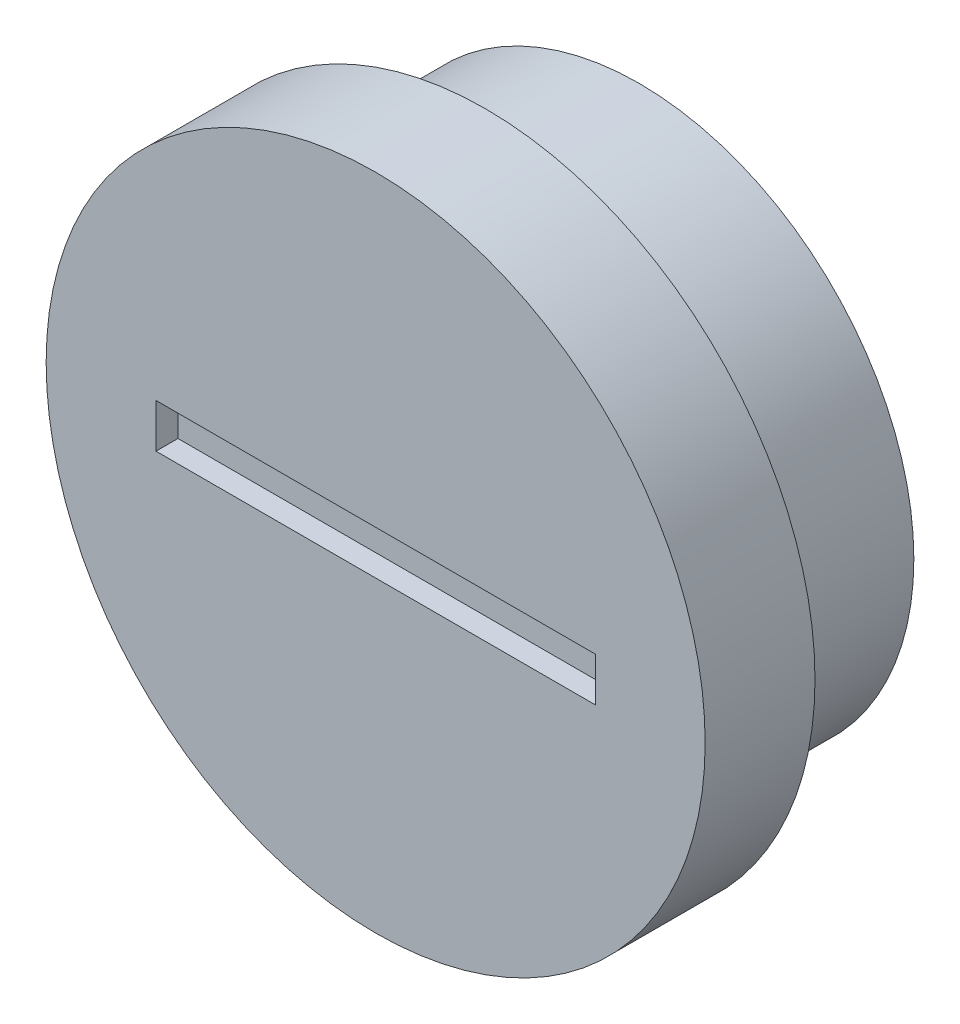
ISO-10303-21;
HEADER;
FILE_DESCRIPTION(('STEP AP214'),'2;1');
FILE_NAME('part.step','',(''),(''),'','','');
FILE_SCHEMA(('AUTOMOTIVE_DESIGN { 1 0 10303 214 1 1 1 1 }'));
ENDSEC;
DATA;
#1=APPLICATION_CONTEXT('core data for automotive mechanical design processes');
#2=APPLICATION_PROTOCOL_DEFINITION('international standard','automotive_design',2000,#1);
#3=PRODUCT_CONTEXT('',#1,'mechanical');
#4=PRODUCT('Part','Part','',(#3));
#5=PRODUCT_RELATED_PRODUCT_CATEGORY('part','',(#4));
#6=PRODUCT_DEFINITION_FORMATION('','',#4);
#7=PRODUCT_DEFINITION_CONTEXT('part definition',#1,'design');
#8=PRODUCT_DEFINITION('design','',#6,#7);
#9=PRODUCT_DEFINITION_SHAPE('','',#8);
#10=(LENGTH_UNIT() NAMED_UNIT(*) SI_UNIT(.MILLI.,.METRE.));
#11=(NAMED_UNIT(*) PLANE_ANGLE_UNIT() SI_UNIT($,.RADIAN.));
#12=(NAMED_UNIT(*) SI_UNIT($,.STERADIAN.) SOLID_ANGLE_UNIT());
#13=UNCERTAINTY_MEASURE_WITH_UNIT(LENGTH_MEASURE(1.E-05),#10,'distance_accuracy_value','');
#14=(GEOMETRIC_REPRESENTATION_CONTEXT(3) GLOBAL_UNCERTAINTY_ASSIGNED_CONTEXT((#13)) GLOBAL_UNIT_ASSIGNED_CONTEXT((#10,
#11,#12)) REPRESENTATION_CONTEXT('',''));
#15=CARTESIAN_POINT('',(0.,0.,0.));
#16=DIRECTION('',(0.,0.,1.));
#17=DIRECTION('',(1.,0.,0.));
#18=AXIS2_PLACEMENT_3D('',#15,#16,#17);
#19=CARTESIAN_POINT('',(0.,0.,0.));
#20=DIRECTION('',(0.,0.,1.));
#21=DIRECTION('',(1.,0.,0.));
#22=AXIS2_PLACEMENT_3D('',#19,#20,#21);
#23=PLANE('',#22);
#24=CARTESIAN_POINT('',(0.,0.,0.));
#25=DIRECTION('',(0.,0.,1.));
#26=DIRECTION('',(1.,0.,0.));
#27=AXIS2_PLACEMENT_3D('',#24,#25,#26);
#28=CIRCLE('',#27,12.5);
#29=CARTESIAN_POINT('',(12.5,0.,0.));
#30=VERTEX_POINT('',#29);
#31=EDGE_CURVE('E180',#30,#30,#28,.T.);
#32=ORIENTED_EDGE('',*,*,#31,.F.);
#33=EDGE_LOOP('',(#32));
#34=FACE_BOUND('',#33,.T.);
#35=CARTESIAN_POINT('',(0.,0.,0.));
#36=DIRECTION('',(0.,0.,1.));
#37=DIRECTION('',(1.,0.,0.));
#38=AXIS2_PLACEMENT_3D('',#35,#36,#37);
#39=CIRCLE('',#38,10.65);
#40=CARTESIAN_POINT('',(10.65,0.,0.));
#41=VERTEX_POINT('',#40);
#42=EDGE_CURVE('E177',#41,#41,#39,.T.);
#43=ORIENTED_EDGE('',*,*,#42,.T.);
#44=EDGE_LOOP('',(#43));
#45=FACE_BOUND('',#44,.T.);
#46=ADVANCED_FACE('F32',(#34,#45),#23,.F.);
#47=CARTESIAN_POINT('',(0.,0.,7.));
#48=DIRECTION('',(0.,0.,-1.));
#49=DIRECTION('',(-1.,0.,0.));
#50=AXIS2_PLACEMENT_3D('',#47,#48,#49);
#51=CYLINDRICAL_SURFACE('',#50,12.5);
#52=CARTESIAN_POINT('',(0.,0.,7.));
#53=DIRECTION('',(0.,0.,1.));
#54=DIRECTION('',(1.,0.,0.));
#55=AXIS2_PLACEMENT_3D('',#52,#53,#54);
#56=CIRCLE('',#55,12.5);
#57=CARTESIAN_POINT('',(12.5,0.,7.));
#58=VERTEX_POINT('',#57);
#59=EDGE_CURVE('E40',#58,#58,#56,.T.);
#60=ORIENTED_EDGE('',*,*,#59,.F.);
#61=EDGE_LOOP('',(#60));
#62=FACE_BOUND('',#61,.T.);
#63=ORIENTED_EDGE('',*,*,#31,.T.);
#64=EDGE_LOOP('',(#63));
#65=FACE_BOUND('',#64,.T.);
#66=ADVANCED_FACE('F34',(#62,#65),#51,.T.);
#67=CARTESIAN_POINT('',(0.,0.,7.));
#68=DIRECTION('',(0.,0.,-1.));
#69=DIRECTION('',(-1.,0.,0.));
#70=AXIS2_PLACEMENT_3D('',#67,#68,#69);
#71=CYLINDRICAL_SURFACE('',#70,10.65);
#72=CARTESIAN_POINT('',(0.,0.,7.));
#73=DIRECTION('',(0.,0.,1.));
#74=DIRECTION('',(1.,0.,0.));
#75=AXIS2_PLACEMENT_3D('',#72,#73,#74);
#76=CIRCLE('',#75,10.65);
#77=CARTESIAN_POINT('',(10.65,0.,7.));
#78=VERTEX_POINT('',#77);
#79=EDGE_CURVE('E172',#78,#78,#76,.T.);
#80=ORIENTED_EDGE('',*,*,#79,.T.);
#81=EDGE_LOOP('',(#80));
#82=FACE_BOUND('',#81,.T.);
#83=ORIENTED_EDGE('',*,*,#42,.F.);
#84=EDGE_LOOP('',(#83));
#85=FACE_BOUND('',#84,.T.);
#86=ADVANCED_FACE('F190',(#82,#85),#71,.F.);
#87=CARTESIAN_POINT('',(0.,0.,7.));
#88=DIRECTION('',(0.,0.,1.));
#89=DIRECTION('',(1.,0.,0.));
#90=AXIS2_PLACEMENT_3D('',#87,#88,#89);
#91=PLANE('',#90);
#92=CARTESIAN_POINT('',(0.,0.,7.));
#93=DIRECTION('',(0.,0.,1.));
#94=DIRECTION('',(1.,0.,0.));
#95=AXIS2_PLACEMENT_3D('',#92,#93,#94);
#96=CIRCLE('',#95,9.);
#97=CARTESIAN_POINT('',(9.,0.,7.));
#98=VERTEX_POINT('',#97);
#99=EDGE_CURVE('E11',#98,#98,#96,.F.);
#100=ORIENTED_EDGE('',*,*,#99,.F.);
#101=EDGE_LOOP('',(#100));
#102=FACE_BOUND('',#101,.T.);
#103=ORIENTED_EDGE('',*,*,#79,.F.);
#104=EDGE_LOOP('',(#103));
#105=FACE_BOUND('',#104,.T.);
#106=ADVANCED_FACE('F192',(#102,#105),#91,.F.);
#107=CARTESIAN_POINT('',(0.,0.,12.));
#108=DIRECTION('',(0.,0.,-1.));
#109=DIRECTION('',(-1.,0.,0.));
#110=AXIS2_PLACEMENT_3D('',#107,#108,#109);
#111=CYLINDRICAL_SURFACE('',#110,15.);
#112=CARTESIAN_POINT('',(0.,0.,12.));
#113=DIRECTION('',(0.,0.,1.));
#114=DIRECTION('',(1.,0.,0.));
#115=AXIS2_PLACEMENT_3D('',#112,#113,#114);
#116=CIRCLE('',#115,15.);
#117=CARTESIAN_POINT('',(15.,0.,12.));
#118=VERTEX_POINT('',#117);
#119=EDGE_CURVE('E169',#118,#118,#116,.T.);
#120=ORIENTED_EDGE('',*,*,#119,.F.);
#121=EDGE_LOOP('',(#120));
#122=FACE_BOUND('',#121,.T.);
#123=CARTESIAN_POINT('',(0.,0.,7.));
#124=DIRECTION('',(0.,0.,1.));
#125=DIRECTION('',(1.,0.,0.));
#126=AXIS2_PLACEMENT_3D('',#123,#124,#125);
#127=CIRCLE('',#126,15.);
#128=CARTESIAN_POINT('',(15.,0.,7.));
#129=VERTEX_POINT('',#128);
#130=EDGE_CURVE('E168',#129,#129,#127,.T.);
#131=ORIENTED_EDGE('',*,*,#130,.T.);
#132=EDGE_LOOP('',(#131));
#133=FACE_BOUND('',#132,.T.);
#134=ADVANCED_FACE('F199',(#122,#133),#111,.T.);
#135=CARTESIAN_POINT('',(0.,0.,12.));
#136=DIRECTION('',(0.,0.,1.));
#137=DIRECTION('',(1.,0.,0.));
#138=AXIS2_PLACEMENT_3D('',#135,#136,#137);
#139=PLANE('',#138);
#140=DIRECTION('',(0.,1.,0.));
#141=VECTOR('',#140,1.);
#142=CARTESIAN_POINT('',(10.,-1.,12.));
#143=LINE('',#142,#141);
#144=CARTESIAN_POINT('',(10.,-1.,12.));
#145=VERTEX_POINT('',#144);
#146=CARTESIAN_POINT('',(10.,1.,12.));
#147=VERTEX_POINT('',#146);
#148=EDGE_CURVE('E55',#145,#147,#143,.T.);
#149=ORIENTED_EDGE('',*,*,#148,.F.);
#150=DIRECTION('',(1.,0.,0.));
#151=VECTOR('',#150,1.);
#152=CARTESIAN_POINT('',(-10.,-1.,12.));
#153=LINE('',#152,#151);
#154=CARTESIAN_POINT('',(-10.,-1.,12.));
#155=VERTEX_POINT('',#154);
#156=EDGE_CURVE('E139',#155,#145,#153,.T.);
#157=ORIENTED_EDGE('',*,*,#156,.F.);
#158=DIRECTION('',(0.,-1.,0.));
#159=VECTOR('',#158,1.);
#160=CARTESIAN_POINT('',(-10.,-1.,12.));
#161=LINE('',#160,#159);
#162=CARTESIAN_POINT('',(-10.,1.,12.));
#163=VERTEX_POINT('',#162);
#164=EDGE_CURVE('E153',#163,#155,#161,.T.);
#165=ORIENTED_EDGE('',*,*,#164,.F.);
#166=DIRECTION('',(-1.,0.,0.));
#167=VECTOR('',#166,1.);
#168=CARTESIAN_POINT('',(-10.,1.,12.));
#169=LINE('',#168,#167);
#170=EDGE_CURVE('E150',#147,#163,#169,.T.);
#171=ORIENTED_EDGE('',*,*,#170,.F.);
#172=EDGE_LOOP('',(#149,#157,#165,#171));
#173=FACE_BOUND('',#172,.T.);
#174=ORIENTED_EDGE('',*,*,#119,.T.);
#175=EDGE_LOOP('',(#174));
#176=FACE_BOUND('',#175,.T.);
#177=ADVANCED_FACE('F206',(#173,#176),#139,.T.);
#178=ORIENTED_EDGE('',*,*,#59,.T.);
#179=EDGE_LOOP('',(#178));
#180=FACE_BOUND('',#179,.T.);
#181=ORIENTED_EDGE('',*,*,#130,.F.);
#182=EDGE_LOOP('',(#181));
#183=FACE_BOUND('',#182,.T.);
#184=ADVANCED_FACE('F202',(#180,#183),#91,.F.);
#185=CARTESIAN_POINT('',(0.,0.,-0.5));
#186=DIRECTION('',(0.,0.,1.));
#187=DIRECTION('',(1.,0.,0.));
#188=AXIS2_PLACEMENT_3D('',#185,#186,#187);
#189=CYLINDRICAL_SURFACE('',#188,9.);
#190=CARTESIAN_POINT('',(0.,0.,-0.5));
#191=DIRECTION('',(0.,0.,-1.));
#192=DIRECTION('',(-1.,0.,0.));
#193=AXIS2_PLACEMENT_3D('',#190,#191,#192);
#194=CIRCLE('',#193,9.);
#195=CARTESIAN_POINT('',(-9.,0.,-0.5));
#196=VERTEX_POINT('',#195);
#197=EDGE_CURVE('E160',#196,#196,#194,.T.);
#198=ORIENTED_EDGE('',*,*,#197,.F.);
#199=EDGE_LOOP('',(#198));
#200=FACE_BOUND('',#199,.T.);
#201=ORIENTED_EDGE('',*,*,#99,.T.);
#202=EDGE_LOOP('',(#201));
#203=FACE_BOUND('',#202,.T.);
#204=ADVANCED_FACE('F210',(#200,#203),#189,.T.);
#205=CARTESIAN_POINT('',(0.,0.,-0.5));
#206=DIRECTION('',(0.,0.,-1.));
#207=DIRECTION('',(-1.,0.,0.));
#208=AXIS2_PLACEMENT_3D('',#205,#206,#207);
#209=PLANE('',#208);
#210=DIRECTION('',(0.,1.,0.));
#211=VECTOR('',#210,1.);
#212=CARTESIAN_POINT('',(-2.5,2.,-0.5));
#213=LINE('',#212,#211);
#214=CARTESIAN_POINT('',(-2.5,0.,-0.5));
#215=VERTEX_POINT('',#214);
#216=CARTESIAN_POINT('',(-2.5,2.,-0.5));
#217=VERTEX_POINT('',#216);
#218=EDGE_CURVE('E47',#215,#217,#213,.T.);
#219=ORIENTED_EDGE('',*,*,#218,.F.);
#220=DIRECTION('',(-1.,0.,0.));
#221=VECTOR('',#220,1.);
#222=CARTESIAN_POINT('',(2.5,0.,-0.5));
#223=LINE('',#222,#221);
#224=CARTESIAN_POINT('',(2.5,0.,-0.5));
#225=VERTEX_POINT('',#224);
#226=EDGE_CURVE('E117',#225,#215,#223,.T.);
#227=ORIENTED_EDGE('',*,*,#226,.F.);
#228=DIRECTION('',(0.,-1.,0.));
#229=VECTOR('',#228,1.);
#230=CARTESIAN_POINT('',(2.5,2.,-0.5));
#231=LINE('',#230,#229);
#232=CARTESIAN_POINT('',(2.5,2.,-0.5));
#233=VERTEX_POINT('',#232);
#234=EDGE_CURVE('E120',#233,#225,#231,.T.);
#235=ORIENTED_EDGE('',*,*,#234,.F.);
#236=DIRECTION('',(1.,0.,0.));
#237=VECTOR('',#236,1.);
#238=CARTESIAN_POINT('',(2.5,2.,-0.5));
#239=LINE('',#238,#237);
#240=EDGE_CURVE('E126',#217,#233,#239,.T.);
#241=ORIENTED_EDGE('',*,*,#240,.F.);
#242=EDGE_LOOP('',(#219,#227,#235,#241));
#243=FACE_BOUND('',#242,.T.);
#244=ORIENTED_EDGE('',*,*,#197,.T.);
#245=EDGE_LOOP('',(#244));
#246=FACE_BOUND('',#245,.T.);
#247=ADVANCED_FACE('F217',(#243,#246),#209,.T.);
#248=CARTESIAN_POINT('',(10.,-1.,11.));
#249=DIRECTION('',(1.,0.,0.));
#250=DIRECTION('',(0.,0.,-1.));
#251=AXIS2_PLACEMENT_3D('',#248,#249,#250);
#252=PLANE('',#251);
#253=ORIENTED_EDGE('',*,*,#148,.T.);
#254=DIRECTION('',(0.,0.,1.));
#255=VECTOR('',#254,1.);
#256=CARTESIAN_POINT('',(10.,1.,11.));
#257=LINE('',#256,#255);
#258=CARTESIAN_POINT('',(10.,1.,11.));
#259=VERTEX_POINT('',#258);
#260=EDGE_CURVE('E148',#259,#147,#257,.T.);
#261=ORIENTED_EDGE('',*,*,#260,.F.);
#262=DIRECTION('',(0.,1.,0.));
#263=VECTOR('',#262,1.);
#264=CARTESIAN_POINT('',(10.,-1.,11.));
#265=LINE('',#264,#263);
#266=CARTESIAN_POINT('',(10.,-1.,11.));
#267=VERTEX_POINT('',#266);
#268=EDGE_CURVE('E135',#267,#259,#265,.T.);
#269=ORIENTED_EDGE('',*,*,#268,.F.);
#270=DIRECTION('',(0.,0.,1.));
#271=VECTOR('',#270,1.);
#272=CARTESIAN_POINT('',(10.,-1.,11.));
#273=LINE('',#272,#271);
#274=EDGE_CURVE('E158',#267,#145,#273,.T.);
#275=ORIENTED_EDGE('',*,*,#274,.T.);
#276=EDGE_LOOP('',(#253,#261,#269,#275));
#277=FACE_BOUND('',#276,.T.);
#278=ADVANCED_FACE('F221',(#277),#252,.F.);
#279=CARTESIAN_POINT('',(-10.,-1.,11.));
#280=DIRECTION('',(0.,-1.,0.));
#281=DIRECTION('',(0.,0.,-1.));
#282=AXIS2_PLACEMENT_3D('',#279,#280,#281);
#283=PLANE('',#282);
#284=ORIENTED_EDGE('',*,*,#156,.T.);
#285=ORIENTED_EDGE('',*,*,#274,.F.);
#286=DIRECTION('',(1.,0.,0.));
#287=VECTOR('',#286,1.);
#288=CARTESIAN_POINT('',(-10.,-1.,11.));
#289=LINE('',#288,#287);
#290=CARTESIAN_POINT('',(-10.,-1.,11.));
#291=VERTEX_POINT('',#290);
#292=EDGE_CURVE('E145',#291,#267,#289,.T.);
#293=ORIENTED_EDGE('',*,*,#292,.F.);
#294=DIRECTION('',(0.,0.,1.));
#295=VECTOR('',#294,1.);
#296=CARTESIAN_POINT('',(-10.,-1.,11.));
#297=LINE('',#296,#295);
#298=EDGE_CURVE('E161',#291,#155,#297,.T.);
#299=ORIENTED_EDGE('',*,*,#298,.T.);
#300=EDGE_LOOP('',(#284,#285,#293,#299));
#301=FACE_BOUND('',#300,.T.);
#302=ADVANCED_FACE('F225',(#301),#283,.F.);
#303=CARTESIAN_POINT('',(-10.,-1.,11.));
#304=DIRECTION('',(-1.,0.,0.));
#305=DIRECTION('',(0.,0.,1.));
#306=AXIS2_PLACEMENT_3D('',#303,#304,#305);
#307=PLANE('',#306);
#308=ORIENTED_EDGE('',*,*,#164,.T.);
#309=ORIENTED_EDGE('',*,*,#298,.F.);
#310=DIRECTION('',(0.,-1.,0.));
#311=VECTOR('',#310,1.);
#312=CARTESIAN_POINT('',(-10.,-1.,11.));
#313=LINE('',#312,#311);
#314=CARTESIAN_POINT('',(-10.,1.,11.));
#315=VERTEX_POINT('',#314);
#316=EDGE_CURVE('E142',#315,#291,#313,.T.);
#317=ORIENTED_EDGE('',*,*,#316,.F.);
#318=DIRECTION('',(0.,0.,1.));
#319=VECTOR('',#318,1.);
#320=CARTESIAN_POINT('',(-10.,1.,11.));
#321=LINE('',#320,#319);
#322=EDGE_CURVE('E163',#315,#163,#321,.T.);
#323=ORIENTED_EDGE('',*,*,#322,.T.);
#324=EDGE_LOOP('',(#308,#309,#317,#323));
#325=FACE_BOUND('',#324,.T.);
#326=ADVANCED_FACE('F230',(#325),#307,.F.);
#327=CARTESIAN_POINT('',(-10.,1.,11.));
#328=DIRECTION('',(0.,1.,0.));
#329=DIRECTION('',(0.,0.,1.));
#330=AXIS2_PLACEMENT_3D('',#327,#328,#329);
#331=PLANE('',#330);
#332=ORIENTED_EDGE('',*,*,#170,.T.);
#333=ORIENTED_EDGE('',*,*,#322,.F.);
#334=DIRECTION('',(-1.,0.,0.));
#335=VECTOR('',#334,1.);
#336=CARTESIAN_POINT('',(-10.,1.,11.));
#337=LINE('',#336,#335);
#338=EDGE_CURVE('E138',#259,#315,#337,.T.);
#339=ORIENTED_EDGE('',*,*,#338,.F.);
#340=ORIENTED_EDGE('',*,*,#260,.T.);
#341=EDGE_LOOP('',(#332,#333,#339,#340));
#342=FACE_BOUND('',#341,.T.);
#343=ADVANCED_FACE('F226',(#342),#331,.F.);
#344=CARTESIAN_POINT('',(0.,0.,11.));
#345=DIRECTION('',(0.,0.,-1.));
#346=DIRECTION('',(-1.,0.,0.));
#347=AXIS2_PLACEMENT_3D('',#344,#345,#346);
#348=PLANE('',#347);
#349=ORIENTED_EDGE('',*,*,#268,.T.);
#350=ORIENTED_EDGE('',*,*,#338,.T.);
#351=ORIENTED_EDGE('',*,*,#316,.T.);
#352=ORIENTED_EDGE('',*,*,#292,.T.);
#353=EDGE_LOOP('',(#349,#350,#351,#352));
#354=FACE_BOUND('',#353,.T.);
#355=ADVANCED_FACE('F229',(#354),#348,.F.);
#356=CARTESIAN_POINT('',(-2.5,2.,2.5));
#357=DIRECTION('',(-1.,0.,0.));
#358=DIRECTION('',(0.,-1.,0.));
#359=AXIS2_PLACEMENT_3D('',#356,#357,#358);
#360=PLANE('',#359);
#361=ORIENTED_EDGE('',*,*,#218,.T.);
#362=DIRECTION('',(0.,0.,-1.));
#363=VECTOR('',#362,1.);
#364=CARTESIAN_POINT('',(-2.5,2.,2.5));
#365=LINE('',#364,#363);
#366=CARTESIAN_POINT('',(-2.5,2.,2.5));
#367=VERTEX_POINT('',#366);
#368=EDGE_CURVE('E95',#367,#217,#365,.T.);
#369=ORIENTED_EDGE('',*,*,#368,.F.);
#370=DIRECTION('',(0.,1.,0.));
#371=VECTOR('',#370,1.);
#372=CARTESIAN_POINT('',(-2.5,2.,2.5));
#373=LINE('',#372,#371);
#374=CARTESIAN_POINT('',(-2.5,0.,2.5));
#375=VERTEX_POINT('',#374);
#376=EDGE_CURVE('E99',#375,#367,#373,.T.);
#377=ORIENTED_EDGE('',*,*,#376,.F.);
#378=DIRECTION('',(0.,0.,-1.));
#379=VECTOR('',#378,1.);
#380=CARTESIAN_POINT('',(-2.5,0.,2.5));
#381=LINE('',#380,#379);
#382=EDGE_CURVE('E130',#375,#215,#381,.T.);
#383=ORIENTED_EDGE('',*,*,#382,.T.);
#384=EDGE_LOOP('',(#361,#369,#377,#383));
#385=FACE_BOUND('',#384,.T.);
#386=ADVANCED_FACE('F97',(#385),#360,.F.);
#387=CARTESIAN_POINT('',(2.5,0.,2.5));
#388=DIRECTION('',(0.,-1.,0.));
#389=DIRECTION('',(0.,0.,-1.));
#390=AXIS2_PLACEMENT_3D('',#387,#388,#389);
#391=PLANE('',#390);
#392=ORIENTED_EDGE('',*,*,#226,.T.);
#393=ORIENTED_EDGE('',*,*,#382,.F.);
#394=DIRECTION('',(-1.,0.,0.));
#395=VECTOR('',#394,1.);
#396=CARTESIAN_POINT('',(2.5,0.,2.5));
#397=LINE('',#396,#395);
#398=CARTESIAN_POINT('',(2.5,0.,2.5));
#399=VERTEX_POINT('',#398);
#400=EDGE_CURVE('E105',#399,#375,#397,.T.);
#401=ORIENTED_EDGE('',*,*,#400,.F.);
#402=DIRECTION('',(0.,0.,-1.));
#403=VECTOR('',#402,1.);
#404=CARTESIAN_POINT('',(2.5,0.,2.5));
#405=LINE('',#404,#403);
#406=EDGE_CURVE('E132',#399,#225,#405,.T.);
#407=ORIENTED_EDGE('',*,*,#406,.T.);
#408=EDGE_LOOP('',(#392,#393,#401,#407));
#409=FACE_BOUND('',#408,.T.);
#410=ADVANCED_FACE('F243',(#409),#391,.F.);
#411=CARTESIAN_POINT('',(2.5,2.,2.5));
#412=DIRECTION('',(1.,0.,0.));
#413=DIRECTION('',(0.,1.,0.));
#414=AXIS2_PLACEMENT_3D('',#411,#412,#413);
#415=PLANE('',#414);
#416=ORIENTED_EDGE('',*,*,#234,.T.);
#417=ORIENTED_EDGE('',*,*,#406,.F.);
#418=DIRECTION('',(0.,-1.,0.));
#419=VECTOR('',#418,1.);
#420=CARTESIAN_POINT('',(2.5,2.,2.5));
#421=LINE('',#420,#419);
#422=CARTESIAN_POINT('',(2.5,2.,2.5));
#423=VERTEX_POINT('',#422);
#424=EDGE_CURVE('E113',#423,#399,#421,.T.);
#425=ORIENTED_EDGE('',*,*,#424,.F.);
#426=DIRECTION('',(0.,0.,-1.));
#427=VECTOR('',#426,1.);
#428=CARTESIAN_POINT('',(2.5,2.,2.5));
#429=LINE('',#428,#427);
#430=EDGE_CURVE('E104',#423,#233,#429,.T.);
#431=ORIENTED_EDGE('',*,*,#430,.T.);
#432=EDGE_LOOP('',(#416,#417,#425,#431));
#433=FACE_BOUND('',#432,.T.);
#434=ADVANCED_FACE('F246',(#433),#415,.F.);
#435=CARTESIAN_POINT('',(2.5,2.,2.5));
#436=DIRECTION('',(0.,1.,0.));
#437=DIRECTION('',(0.,0.,1.));
#438=AXIS2_PLACEMENT_3D('',#435,#436,#437);
#439=PLANE('',#438);
#440=ORIENTED_EDGE('',*,*,#240,.T.);
#441=ORIENTED_EDGE('',*,*,#430,.F.);
#442=DIRECTION('',(1.,0.,0.));
#443=VECTOR('',#442,1.);
#444=CARTESIAN_POINT('',(2.5,2.,2.5));
#445=LINE('',#444,#443);
#446=EDGE_CURVE('E108',#367,#423,#445,.T.);
#447=ORIENTED_EDGE('',*,*,#446,.F.);
#448=ORIENTED_EDGE('',*,*,#368,.T.);
#449=EDGE_LOOP('',(#440,#441,#447,#448));
#450=FACE_BOUND('',#449,.T.);
#451=ADVANCED_FACE('F109',(#450),#439,.F.);
#452=CARTESIAN_POINT('',(0.,0.,2.5));
#453=DIRECTION('',(0.,0.,-1.));
#454=DIRECTION('',(-1.,0.,0.));
#455=AXIS2_PLACEMENT_3D('',#452,#453,#454);
#456=PLANE('',#455);
#457=ORIENTED_EDGE('',*,*,#376,.T.);
#458=ORIENTED_EDGE('',*,*,#446,.T.);
#459=ORIENTED_EDGE('',*,*,#424,.T.);
#460=ORIENTED_EDGE('',*,*,#400,.T.);
#461=EDGE_LOOP('',(#457,#458,#459,#460));
#462=FACE_BOUND('',#461,.T.);
#463=ADVANCED_FACE('F115',(#462),#456,.T.);
#464=CLOSED_SHELL('',(#46,#66,#86,#106,#134,#177,#184,#204,#247,#278,#302,#326,#343,#355,#386,
#410,#434,#451,#463));
#465=MANIFOLD_SOLID_BREP('B2',#464);
#466=ADVANCED_BREP_SHAPE_REPRESENTATION('',(#18,#465),#14);
#467=SHAPE_DEFINITION_REPRESENTATION(#9,#466);
ENDSEC;
END-ISO-10303-21;
